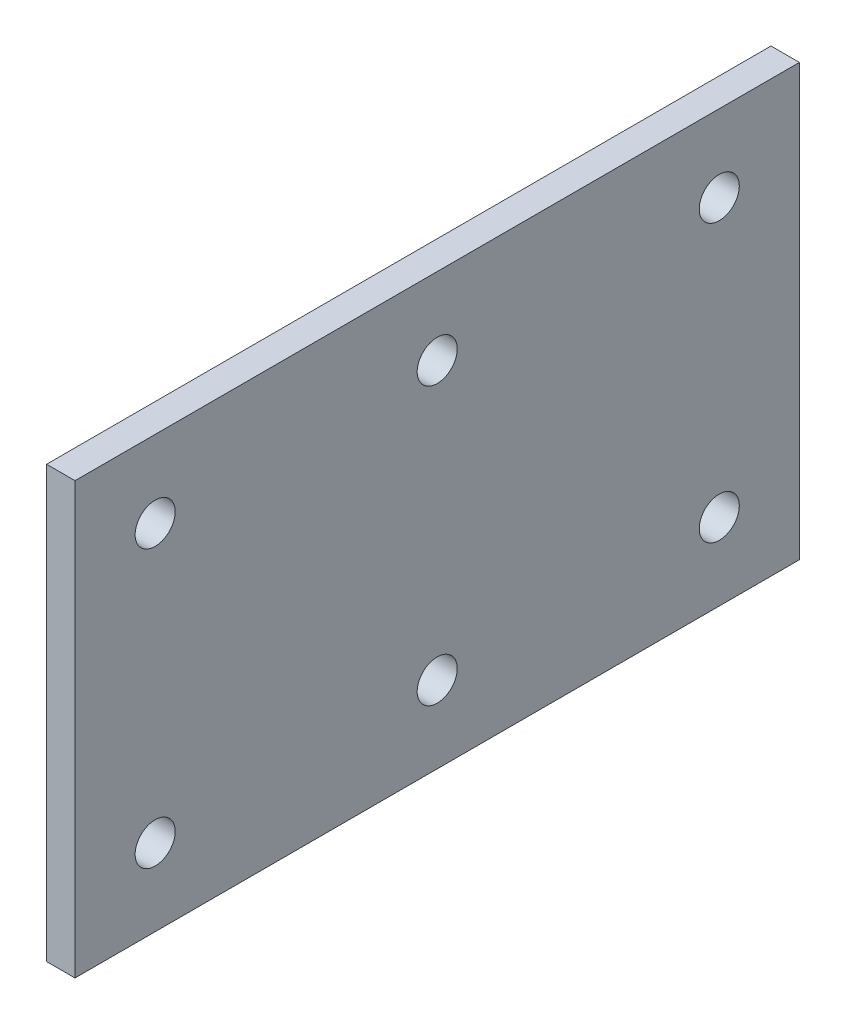
ISO-10303-21;
HEADER;
FILE_DESCRIPTION(('STEP AP214'),'2;1');
FILE_NAME('part.step','',(''),(''),'','','');
FILE_SCHEMA(('AUTOMOTIVE_DESIGN { 1 0 10303 214 1 1 1 1 }'));
ENDSEC;
DATA;
#1=APPLICATION_CONTEXT('core data for automotive mechanical design processes');
#2=APPLICATION_PROTOCOL_DEFINITION('international standard','automotive_design',2000,#1);
#3=PRODUCT_CONTEXT('',#1,'mechanical');
#4=PRODUCT('Part','Part','',(#3));
#5=PRODUCT_RELATED_PRODUCT_CATEGORY('part','',(#4));
#6=PRODUCT_DEFINITION_FORMATION('','',#4);
#7=PRODUCT_DEFINITION_CONTEXT('part definition',#1,'design');
#8=PRODUCT_DEFINITION('design','',#6,#7);
#9=PRODUCT_DEFINITION_SHAPE('','',#8);
#10=(LENGTH_UNIT() NAMED_UNIT(*) SI_UNIT(.MILLI.,.METRE.));
#11=(NAMED_UNIT(*) PLANE_ANGLE_UNIT() SI_UNIT($,.RADIAN.));
#12=(NAMED_UNIT(*) SI_UNIT($,.STERADIAN.) SOLID_ANGLE_UNIT());
#13=UNCERTAINTY_MEASURE_WITH_UNIT(LENGTH_MEASURE(1.E-05),#10,'distance_accuracy_value','');
#14=(GEOMETRIC_REPRESENTATION_CONTEXT(3) GLOBAL_UNCERTAINTY_ASSIGNED_CONTEXT((#13)) GLOBAL_UNIT_ASSIGNED_CONTEXT((#10,
#11,#12)) REPRESENTATION_CONTEXT('',''));
#15=CARTESIAN_POINT('',(0.,0.,0.));
#16=DIRECTION('',(0.,0.,1.));
#17=DIRECTION('',(1.,0.,0.));
#18=AXIS2_PLACEMENT_3D('',#15,#16,#17);
#19=CARTESIAN_POINT('',(3.3782,-23.9552071881607,32.8642706131078));
#20=DIRECTION('',(0.,1.,0.));
#21=DIRECTION('',(0.,0.,1.));
#22=AXIS2_PLACEMENT_3D('',#19,#20,#21);
#23=PLANE('',#22);
#24=DIRECTION('',(0.,0.,-1.));
#25=VECTOR('',#24,1.);
#26=CARTESIAN_POINT('',(0.,-23.9552071881607,32.8642706131078));
#27=LINE('',#26,#25);
#28=CARTESIAN_POINT('',(0.,-23.9552071881607,32.8642706131078));
#29=VERTEX_POINT('',#28);
#30=CARTESIAN_POINT('',(0.,-23.9552071881607,-53.2163293868922));
#31=VERTEX_POINT('',#30);
#32=EDGE_CURVE('E95',#29,#31,#27,.T.);
#33=ORIENTED_EDGE('',*,*,#32,.T.);
#34=DIRECTION('',(-1.,0.,0.));
#35=VECTOR('',#34,1.);
#36=CARTESIAN_POINT('',(3.3782,-23.9552071881607,-53.2163293868922));
#37=LINE('',#36,#35);
#38=CARTESIAN_POINT('',(3.3782,-23.9552071881607,-53.2163293868922));
#39=VERTEX_POINT('',#38);
#40=EDGE_CURVE('E11',#39,#31,#37,.T.);
#41=ORIENTED_EDGE('',*,*,#40,.F.);
#42=DIRECTION('',(0.,0.,-1.));
#43=VECTOR('',#42,1.);
#44=CARTESIAN_POINT('',(3.3782,-23.9552071881607,32.8642706131078));
#45=LINE('',#44,#43);
#46=CARTESIAN_POINT('',(3.3782,-23.9552071881607,32.8642706131078));
#47=VERTEX_POINT('',#46);
#48=EDGE_CURVE('E81',#47,#39,#45,.T.);
#49=ORIENTED_EDGE('',*,*,#48,.F.);
#50=DIRECTION('',(-1.,0.,0.));
#51=VECTOR('',#50,1.);
#52=CARTESIAN_POINT('',(3.3782,-23.9552071881607,32.8642706131078));
#53=LINE('',#52,#51);
#54=EDGE_CURVE('E48',#47,#29,#53,.T.);
#55=ORIENTED_EDGE('',*,*,#54,.T.);
#56=EDGE_LOOP('',(#33,#41,#49,#55));
#57=FACE_BOUND('',#56,.T.);
#58=ADVANCED_FACE('F32',(#57),#23,.F.);
#59=CARTESIAN_POINT('',(3.3782,-23.9552071881607,-53.2163293868922));
#60=DIRECTION('',(0.,0.,1.));
#61=DIRECTION('',(1.,0.,0.));
#62=AXIS2_PLACEMENT_3D('',#59,#60,#61);
#63=PLANE('',#62);
#64=DIRECTION('',(0.,1.,0.));
#65=VECTOR('',#64,1.);
#66=CARTESIAN_POINT('',(0.,-23.9552071881607,-53.2163293868922));
#67=LINE('',#66,#65);
#68=CARTESIAN_POINT('',(0.,27.2257928118393,-53.2163293868922));
#69=VERTEX_POINT('',#68);
#70=EDGE_CURVE('E86',#31,#69,#67,.T.);
#71=ORIENTED_EDGE('',*,*,#70,.T.);
#72=DIRECTION('',(-1.,0.,0.));
#73=VECTOR('',#72,1.);
#74=CARTESIAN_POINT('',(3.3782,27.2257928118393,-53.2163293868922));
#75=LINE('',#74,#73);
#76=CARTESIAN_POINT('',(3.3782,27.2257928118393,-53.2163293868922));
#77=VERTEX_POINT('',#76);
#78=EDGE_CURVE('E40',#77,#69,#75,.T.);
#79=ORIENTED_EDGE('',*,*,#78,.F.);
#80=DIRECTION('',(0.,1.,0.));
#81=VECTOR('',#80,1.);
#82=CARTESIAN_POINT('',(3.3782,-23.9552071881607,-53.2163293868922));
#83=LINE('',#82,#81);
#84=EDGE_CURVE('E73',#39,#77,#83,.T.);
#85=ORIENTED_EDGE('',*,*,#84,.F.);
#86=ORIENTED_EDGE('',*,*,#40,.T.);
#87=EDGE_LOOP('',(#71,#79,#85,#86));
#88=FACE_BOUND('',#87,.T.);
#89=ADVANCED_FACE('F85',(#88),#63,.F.);
#90=CARTESIAN_POINT('',(3.3782,27.2257928118393,32.8642706131078));
#91=DIRECTION('',(0.,1.,0.));
#92=DIRECTION('',(0.,0.,1.));
#93=AXIS2_PLACEMENT_3D('',#90,#91,#92);
#94=PLANE('',#93);
#95=DIRECTION('',(0.,0.,-1.));
#96=VECTOR('',#95,1.);
#97=CARTESIAN_POINT('',(0.,27.2257928118393,32.8642706131078));
#98=LINE('',#97,#96);
#99=CARTESIAN_POINT('',(0.,27.2257928118393,32.8642706131078));
#100=VERTEX_POINT('',#99);
#101=EDGE_CURVE('E99',#100,#69,#98,.T.);
#102=ORIENTED_EDGE('',*,*,#101,.F.);
#103=DIRECTION('',(-1.,0.,0.));
#104=VECTOR('',#103,1.);
#105=CARTESIAN_POINT('',(3.3782,27.2257928118393,32.8642706131078));
#106=LINE('',#105,#104);
#107=CARTESIAN_POINT('',(3.3782,27.2257928118393,32.8642706131078));
#108=VERTEX_POINT('',#107);
#109=EDGE_CURVE('E62',#108,#100,#106,.T.);
#110=ORIENTED_EDGE('',*,*,#109,.F.);
#111=DIRECTION('',(0.,0.,-1.));
#112=VECTOR('',#111,1.);
#113=CARTESIAN_POINT('',(3.3782,27.2257928118393,32.8642706131078));
#114=LINE('',#113,#112);
#115=EDGE_CURVE('E80',#108,#77,#114,.T.);
#116=ORIENTED_EDGE('',*,*,#115,.T.);
#117=ORIENTED_EDGE('',*,*,#78,.T.);
#118=EDGE_LOOP('',(#102,#110,#116,#117));
#119=FACE_BOUND('',#118,.T.);
#120=ADVANCED_FACE('F89',(#119),#94,.T.);
#121=CARTESIAN_POINT('',(3.3782,-23.9552071881607,32.8642706131078));
#122=DIRECTION('',(0.,0.,1.));
#123=DIRECTION('',(1.,0.,0.));
#124=AXIS2_PLACEMENT_3D('',#121,#122,#123);
#125=PLANE('',#124);
#126=DIRECTION('',(0.,1.,0.));
#127=VECTOR('',#126,1.);
#128=CARTESIAN_POINT('',(0.,-23.9552071881607,32.8642706131078));
#129=LINE('',#128,#127);
#130=EDGE_CURVE('E101',#29,#100,#129,.T.);
#131=ORIENTED_EDGE('',*,*,#130,.F.);
#132=ORIENTED_EDGE('',*,*,#54,.F.);
#133=DIRECTION('',(0.,1.,0.));
#134=VECTOR('',#133,1.);
#135=CARTESIAN_POINT('',(3.3782,-23.9552071881607,32.8642706131078));
#136=LINE('',#135,#134);
#137=EDGE_CURVE('E90',#47,#108,#136,.T.);
#138=ORIENTED_EDGE('',*,*,#137,.T.);
#139=ORIENTED_EDGE('',*,*,#109,.T.);
#140=EDGE_LOOP('',(#131,#132,#138,#139));
#141=FACE_BOUND('',#140,.T.);
#142=ADVANCED_FACE('F148',(#141),#125,.T.);
#143=CARTESIAN_POINT('',(3.3782,0.,0.));
#144=DIRECTION('',(1.,0.,0.));
#145=DIRECTION('',(0.,0.,-1.));
#146=AXIS2_PLACEMENT_3D('',#143,#144,#145);
#147=PLANE('',#146);
#148=CARTESIAN_POINT('',(3.3782,18.0817928118393,-43.6913293868922));
#149=DIRECTION('',(1.,0.,0.));
#150=DIRECTION('',(0.,0.,-1.));
#151=AXIS2_PLACEMENT_3D('',#148,#149,#150);
#152=CIRCLE('',#151,2.38125);
#153=CARTESIAN_POINT('',(3.3782,18.0817928118393,-46.0725793868922));
#154=VERTEX_POINT('',#153);
#155=EDGE_CURVE('E135',#154,#154,#152,.T.);
#156=ORIENTED_EDGE('',*,*,#155,.F.);
#157=EDGE_LOOP('',(#156));
#158=FACE_BOUND('',#157,.T.);
#159=CARTESIAN_POINT('',(3.3782,-14.8112071881608,-43.6913293868922));
#160=DIRECTION('',(1.,0.,0.));
#161=DIRECTION('',(0.,0.,-1.));
#162=AXIS2_PLACEMENT_3D('',#159,#160,#161);
#163=CIRCLE('',#162,2.38125);
#164=CARTESIAN_POINT('',(3.3782,-14.8112071881608,-46.0725793868922));
#165=VERTEX_POINT('',#164);
#166=EDGE_CURVE('E129',#165,#165,#163,.T.);
#167=ORIENTED_EDGE('',*,*,#166,.F.);
#168=EDGE_LOOP('',(#167));
#169=FACE_BOUND('',#168,.T.);
#170=CARTESIAN_POINT('',(3.3782,-14.8112071881608,23.3392706131078));
#171=DIRECTION('',(1.,0.,0.));
#172=DIRECTION('',(0.,0.,-1.));
#173=AXIS2_PLACEMENT_3D('',#170,#171,#172);
#174=CIRCLE('',#173,2.38125);
#175=CARTESIAN_POINT('',(3.3782,-14.8112071881608,20.9580206131078));
#176=VERTEX_POINT('',#175);
#177=EDGE_CURVE('E123',#176,#176,#174,.T.);
#178=ORIENTED_EDGE('',*,*,#177,.F.);
#179=EDGE_LOOP('',(#178));
#180=FACE_BOUND('',#179,.T.);
#181=CARTESIAN_POINT('',(3.3782,18.0817928118393,-10.1760293868922));
#182=DIRECTION('',(1.,0.,0.));
#183=DIRECTION('',(0.,0.,-1.));
#184=AXIS2_PLACEMENT_3D('',#181,#182,#183);
#185=CIRCLE('',#184,2.38125);
#186=CARTESIAN_POINT('',(3.3782,18.0817928118393,-12.5572793868922));
#187=VERTEX_POINT('',#186);
#188=EDGE_CURVE('E116',#187,#187,#185,.T.);
#189=ORIENTED_EDGE('',*,*,#188,.F.);
#190=EDGE_LOOP('',(#189));
#191=FACE_BOUND('',#190,.T.);
#192=CARTESIAN_POINT('',(3.3782,-14.8112071881608,-10.1760293868922));
#193=DIRECTION('',(1.,0.,0.));
#194=DIRECTION('',(0.,0.,-1.));
#195=AXIS2_PLACEMENT_3D('',#192,#193,#194);
#196=CIRCLE('',#195,2.38125);
#197=CARTESIAN_POINT('',(3.3782,-14.8112071881608,-12.5572793868922));
#198=VERTEX_POINT('',#197);
#199=EDGE_CURVE('E117',#198,#198,#196,.T.);
#200=ORIENTED_EDGE('',*,*,#199,.F.);
#201=EDGE_LOOP('',(#200));
#202=FACE_BOUND('',#201,.T.);
#203=CARTESIAN_POINT('',(3.3782,18.0817928118393,23.3392706131078));
#204=DIRECTION('',(1.,0.,0.));
#205=DIRECTION('',(0.,0.,-1.));
#206=AXIS2_PLACEMENT_3D('',#203,#204,#205);
#207=CIRCLE('',#206,2.38125);
#208=CARTESIAN_POINT('',(3.3782,18.0817928118393,20.9580206131078));
#209=VERTEX_POINT('',#208);
#210=EDGE_CURVE('E109',#209,#209,#207,.T.);
#211=ORIENTED_EDGE('',*,*,#210,.F.);
#212=EDGE_LOOP('',(#211));
#213=FACE_BOUND('',#212,.T.);
#214=ORIENTED_EDGE('',*,*,#48,.T.);
#215=ORIENTED_EDGE('',*,*,#84,.T.);
#216=ORIENTED_EDGE('',*,*,#115,.F.);
#217=ORIENTED_EDGE('',*,*,#137,.F.);
#218=EDGE_LOOP('',(#214,#215,#216,#217));
#219=FACE_BOUND('',#218,.T.);
#220=ADVANCED_FACE('F77',(#158,#169,#180,#191,#202,#213,#219),#147,.T.);
#221=CARTESIAN_POINT('',(0.,0.,0.));
#222=DIRECTION('',(1.,0.,0.));
#223=DIRECTION('',(0.,0.,-1.));
#224=AXIS2_PLACEMENT_3D('',#221,#222,#223);
#225=PLANE('',#224);
#226=CARTESIAN_POINT('',(0.,18.0817928118393,-43.6913293868922));
#227=DIRECTION('',(1.,0.,0.));
#228=DIRECTION('',(0.,0.,-1.));
#229=AXIS2_PLACEMENT_3D('',#226,#227,#228);
#230=CIRCLE('',#229,2.38125);
#231=CARTESIAN_POINT('',(0.,18.0817928118393,-46.0725793868922));
#232=VERTEX_POINT('',#231);
#233=EDGE_CURVE('E112',#232,#232,#230,.F.);
#234=ORIENTED_EDGE('',*,*,#233,.F.);
#235=EDGE_LOOP('',(#234));
#236=FACE_BOUND('',#235,.T.);
#237=CARTESIAN_POINT('',(0.,-14.8112071881608,-43.6913293868922));
#238=DIRECTION('',(1.,0.,0.));
#239=DIRECTION('',(0.,0.,-1.));
#240=AXIS2_PLACEMENT_3D('',#237,#238,#239);
#241=CIRCLE('',#240,2.38125);
#242=CARTESIAN_POINT('',(0.,-14.8112071881608,-46.0725793868922));
#243=VERTEX_POINT('',#242);
#244=EDGE_CURVE('E132',#243,#243,#241,.F.);
#245=ORIENTED_EDGE('',*,*,#244,.F.);
#246=EDGE_LOOP('',(#245));
#247=FACE_BOUND('',#246,.T.);
#248=CARTESIAN_POINT('',(0.,-14.8112071881608,23.3392706131078));
#249=DIRECTION('',(1.,0.,0.));
#250=DIRECTION('',(0.,0.,-1.));
#251=AXIS2_PLACEMENT_3D('',#248,#249,#250);
#252=CIRCLE('',#251,2.38125);
#253=CARTESIAN_POINT('',(0.,-14.8112071881608,20.9580206131078));
#254=VERTEX_POINT('',#253);
#255=EDGE_CURVE('E126',#254,#254,#252,.F.);
#256=ORIENTED_EDGE('',*,*,#255,.F.);
#257=EDGE_LOOP('',(#256));
#258=FACE_BOUND('',#257,.T.);
#259=CARTESIAN_POINT('',(0.,18.0817928118393,-10.1760293868922));
#260=DIRECTION('',(1.,0.,0.));
#261=DIRECTION('',(0.,0.,-1.));
#262=AXIS2_PLACEMENT_3D('',#259,#260,#261);
#263=CIRCLE('',#262,2.38125);
#264=CARTESIAN_POINT('',(0.,18.0817928118393,-12.5572793868922));
#265=VERTEX_POINT('',#264);
#266=EDGE_CURVE('E120',#265,#265,#263,.F.);
#267=ORIENTED_EDGE('',*,*,#266,.F.);
#268=EDGE_LOOP('',(#267));
#269=FACE_BOUND('',#268,.T.);
#270=CARTESIAN_POINT('',(0.,-14.8112071881608,-10.1760293868922));
#271=DIRECTION('',(1.,0.,0.));
#272=DIRECTION('',(0.,0.,-1.));
#273=AXIS2_PLACEMENT_3D('',#270,#271,#272);
#274=CIRCLE('',#273,2.38125);
#275=CARTESIAN_POINT('',(0.,-14.8112071881608,-12.5572793868922));
#276=VERTEX_POINT('',#275);
#277=EDGE_CURVE('E113',#276,#276,#274,.F.);
#278=ORIENTED_EDGE('',*,*,#277,.F.);
#279=EDGE_LOOP('',(#278));
#280=FACE_BOUND('',#279,.T.);
#281=CARTESIAN_POINT('',(0.,18.0817928118393,23.3392706131078));
#282=DIRECTION('',(1.,0.,0.));
#283=DIRECTION('',(0.,0.,-1.));
#284=AXIS2_PLACEMENT_3D('',#281,#282,#283);
#285=CIRCLE('',#284,2.38125);
#286=CARTESIAN_POINT('',(0.,18.0817928118393,20.9580206131078));
#287=VERTEX_POINT('',#286);
#288=EDGE_CURVE('E97',#287,#287,#285,.F.);
#289=ORIENTED_EDGE('',*,*,#288,.F.);
#290=EDGE_LOOP('',(#289));
#291=FACE_BOUND('',#290,.T.);
#292=ORIENTED_EDGE('',*,*,#32,.F.);
#293=ORIENTED_EDGE('',*,*,#130,.T.);
#294=ORIENTED_EDGE('',*,*,#101,.T.);
#295=ORIENTED_EDGE('',*,*,#70,.F.);
#296=EDGE_LOOP('',(#292,#293,#294,#295));
#297=FACE_BOUND('',#296,.T.);
#298=ADVANCED_FACE('F147',(#236,#247,#258,#269,#280,#291,#297),#225,.F.);
#299=CARTESIAN_POINT('',(-6.73519209080187,18.0817928118393,23.3392706131078));
#300=DIRECTION('',(1.,0.,0.));
#301=DIRECTION('',(0.,0.,-1.));
#302=AXIS2_PLACEMENT_3D('',#299,#300,#301);
#303=CYLINDRICAL_SURFACE('',#302,2.38125);
#304=ORIENTED_EDGE('',*,*,#288,.T.);
#305=EDGE_LOOP('',(#304));
#306=FACE_BOUND('',#305,.T.);
#307=ORIENTED_EDGE('',*,*,#210,.T.);
#308=EDGE_LOOP('',(#307));
#309=FACE_BOUND('',#308,.T.);
#310=ADVANCED_FACE('F160',(#306,#309),#303,.F.);
#311=CARTESIAN_POINT('',(-6.73519209080187,-14.8112071881608,-10.1760293868922));
#312=DIRECTION('',(1.,0.,0.));
#313=DIRECTION('',(0.,0.,-1.));
#314=AXIS2_PLACEMENT_3D('',#311,#312,#313);
#315=CYLINDRICAL_SURFACE('',#314,2.38125);
#316=ORIENTED_EDGE('',*,*,#277,.T.);
#317=EDGE_LOOP('',(#316));
#318=FACE_BOUND('',#317,.T.);
#319=ORIENTED_EDGE('',*,*,#199,.T.);
#320=EDGE_LOOP('',(#319));
#321=FACE_BOUND('',#320,.T.);
#322=ADVANCED_FACE('F162',(#318,#321),#315,.F.);
#323=CARTESIAN_POINT('',(-6.73519209080187,18.0817928118393,-10.1760293868922));
#324=DIRECTION('',(1.,0.,0.));
#325=DIRECTION('',(0.,0.,-1.));
#326=AXIS2_PLACEMENT_3D('',#323,#324,#325);
#327=CYLINDRICAL_SURFACE('',#326,2.38125);
#328=ORIENTED_EDGE('',*,*,#266,.T.);
#329=EDGE_LOOP('',(#328));
#330=FACE_BOUND('',#329,.T.);
#331=ORIENTED_EDGE('',*,*,#188,.T.);
#332=EDGE_LOOP('',(#331));
#333=FACE_BOUND('',#332,.T.);
#334=ADVANCED_FACE('F169',(#330,#333),#327,.F.);
#335=CARTESIAN_POINT('',(-6.73519209080187,-14.8112071881608,23.3392706131078));
#336=DIRECTION('',(1.,0.,0.));
#337=DIRECTION('',(0.,0.,-1.));
#338=AXIS2_PLACEMENT_3D('',#335,#336,#337);
#339=CYLINDRICAL_SURFACE('',#338,2.38125);
#340=ORIENTED_EDGE('',*,*,#255,.T.);
#341=EDGE_LOOP('',(#340));
#342=FACE_BOUND('',#341,.T.);
#343=ORIENTED_EDGE('',*,*,#177,.T.);
#344=EDGE_LOOP('',(#343));
#345=FACE_BOUND('',#344,.T.);
#346=ADVANCED_FACE('F215',(#342,#345),#339,.F.);
#347=CARTESIAN_POINT('',(-6.73519209080187,-14.8112071881608,-43.6913293868922));
#348=DIRECTION('',(1.,0.,0.));
#349=DIRECTION('',(0.,0.,-1.));
#350=AXIS2_PLACEMENT_3D('',#347,#348,#349);
#351=CYLINDRICAL_SURFACE('',#350,2.38125);
#352=ORIENTED_EDGE('',*,*,#244,.T.);
#353=EDGE_LOOP('',(#352));
#354=FACE_BOUND('',#353,.T.);
#355=ORIENTED_EDGE('',*,*,#166,.T.);
#356=EDGE_LOOP('',(#355));
#357=FACE_BOUND('',#356,.T.);
#358=ADVANCED_FACE('F223',(#354,#357),#351,.F.);
#359=CARTESIAN_POINT('',(-6.73519209080187,18.0817928118393,-43.6913293868922));
#360=DIRECTION('',(1.,0.,0.));
#361=DIRECTION('',(0.,0.,-1.));
#362=AXIS2_PLACEMENT_3D('',#359,#360,#361);
#363=CYLINDRICAL_SURFACE('',#362,2.38125);
#364=ORIENTED_EDGE('',*,*,#233,.T.);
#365=EDGE_LOOP('',(#364));
#366=FACE_BOUND('',#365,.T.);
#367=ORIENTED_EDGE('',*,*,#155,.T.);
#368=EDGE_LOOP('',(#367));
#369=FACE_BOUND('',#368,.T.);
#370=ADVANCED_FACE('F143',(#366,#369),#363,.F.);
#371=CLOSED_SHELL('',(#58,#89,#120,#142,#220,#298,#310,#322,#334,#346,#358,#370));
#372=MANIFOLD_SOLID_BREP('B2',#371);
#373=ADVANCED_BREP_SHAPE_REPRESENTATION('',(#18,#372),#14);
#374=SHAPE_DEFINITION_REPRESENTATION(#9,#373);
ENDSEC;
END-ISO-10303-21;
